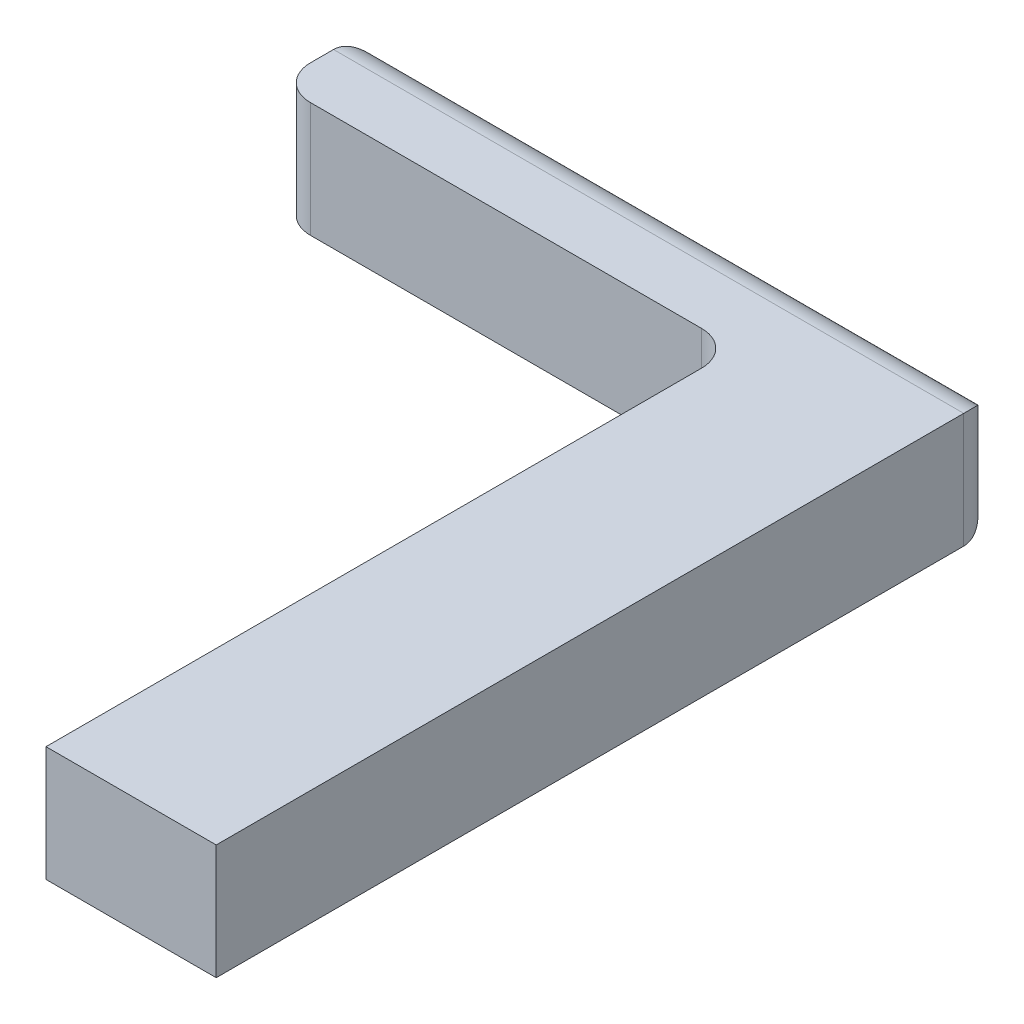
ISO-10303-21;
HEADER;
FILE_DESCRIPTION(('STEP AP214'),'2;1');
FILE_NAME('part.step','',(''),(''),'','','');
FILE_SCHEMA(('AUTOMOTIVE_DESIGN { 1 0 10303 214 1 1 1 1 }'));
ENDSEC;
DATA;
#1=APPLICATION_CONTEXT('core data for automotive mechanical design processes');
#2=APPLICATION_PROTOCOL_DEFINITION('international standard','automotive_design',2000,#1);
#3=PRODUCT_CONTEXT('',#1,'mechanical');
#4=PRODUCT('Part','Part','',(#3));
#5=PRODUCT_RELATED_PRODUCT_CATEGORY('part','',(#4));
#6=PRODUCT_DEFINITION_FORMATION('','',#4);
#7=PRODUCT_DEFINITION_CONTEXT('part definition',#1,'design');
#8=PRODUCT_DEFINITION('design','',#6,#7);
#9=PRODUCT_DEFINITION_SHAPE('','',#8);
#10=(LENGTH_UNIT() NAMED_UNIT(*) SI_UNIT(.MILLI.,.METRE.));
#11=(NAMED_UNIT(*) PLANE_ANGLE_UNIT() SI_UNIT($,.RADIAN.));
#12=(NAMED_UNIT(*) SI_UNIT($,.STERADIAN.) SOLID_ANGLE_UNIT());
#13=UNCERTAINTY_MEASURE_WITH_UNIT(LENGTH_MEASURE(1.E-05),#10,'distance_accuracy_value','');
#14=(GEOMETRIC_REPRESENTATION_CONTEXT(3) GLOBAL_UNCERTAINTY_ASSIGNED_CONTEXT((#13)) GLOBAL_UNIT_ASSIGNED_CONTEXT((#10,
#11,#12)) REPRESENTATION_CONTEXT('',''));
#15=CARTESIAN_POINT('',(0.,0.,0.));
#16=DIRECTION('',(0.,0.,1.));
#17=DIRECTION('',(1.,0.,0.));
#18=AXIS2_PLACEMENT_3D('',#15,#16,#17);
#19=CARTESIAN_POINT('',(-7.4,10.,-34.));
#20=DIRECTION('',(1.,0.,0.));
#21=DIRECTION('',(0.,0.,-1.));
#22=AXIS2_PLACEMENT_3D('',#19,#20,#21);
#23=PLANE('',#22);
#24=DIRECTION('',(0.,0.,1.));
#25=VECTOR('',#24,1.);
#26=CARTESIAN_POINT('',(-7.4,10.,-34.));
#27=LINE('',#26,#25);
#28=CARTESIAN_POINT('',(-7.4,10.,-23.));
#29=VERTEX_POINT('',#28);
#30=CARTESIAN_POINT('',(-7.4,10.,34.));
#31=VERTEX_POINT('',#30);
#32=EDGE_CURVE('E116',#29,#31,#27,.T.);
#33=ORIENTED_EDGE('',*,*,#32,.F.);
#34=DIRECTION('',(0.,1.,0.));
#35=VECTOR('',#34,1.);
#36=CARTESIAN_POINT('',(-7.4,0.,-23.));
#37=LINE('',#36,#35);
#38=CARTESIAN_POINT('',(-7.4,0.,-23.));
#39=VERTEX_POINT('',#38);
#40=EDGE_CURVE('E172',#29,#39,#37,.F.);
#41=ORIENTED_EDGE('',*,*,#40,.T.);
#42=DIRECTION('',(0.,0.,1.));
#43=VECTOR('',#42,1.);
#44=CARTESIAN_POINT('',(-7.4,0.,-34.));
#45=LINE('',#44,#43);
#46=CARTESIAN_POINT('',(-7.4,0.,34.));
#47=VERTEX_POINT('',#46);
#48=EDGE_CURVE('E138',#39,#47,#45,.T.);
#49=ORIENTED_EDGE('',*,*,#48,.T.);
#50=DIRECTION('',(0.,-1.,0.));
#51=VECTOR('',#50,1.);
#52=CARTESIAN_POINT('',(-7.4,10.,34.));
#53=LINE('',#52,#51);
#54=EDGE_CURVE('E131',#31,#47,#53,.T.);
#55=ORIENTED_EDGE('',*,*,#54,.F.);
#56=EDGE_LOOP('',(#33,#41,#49,#55));
#57=FACE_BOUND('',#56,.T.);
#58=ADVANCED_FACE('F37',(#57),#23,.F.);
#59=CARTESIAN_POINT('',(7.40000000000001,10.,34.));
#60=DIRECTION('',(0.,0.,-1.));
#61=DIRECTION('',(-1.,0.,0.));
#62=AXIS2_PLACEMENT_3D('',#59,#60,#61);
#63=PLANE('',#62);
#64=DIRECTION('',(1.,0.,0.));
#65=VECTOR('',#64,1.);
#66=CARTESIAN_POINT('',(7.40000000000001,0.,34.));
#67=LINE('',#66,#65);
#68=CARTESIAN_POINT('',(7.40000000000001,0.,34.));
#69=VERTEX_POINT('',#68);
#70=EDGE_CURVE('E204',#47,#69,#67,.T.);
#71=ORIENTED_EDGE('',*,*,#70,.T.);
#72=DIRECTION('',(0.,-1.,0.));
#73=VECTOR('',#72,1.);
#74=CARTESIAN_POINT('',(7.40000000000001,10.,34.));
#75=LINE('',#74,#73);
#76=CARTESIAN_POINT('',(7.40000000000001,10.,34.));
#77=VERTEX_POINT('',#76);
#78=EDGE_CURVE('E133',#77,#69,#75,.T.);
#79=ORIENTED_EDGE('',*,*,#78,.F.);
#80=DIRECTION('',(1.,0.,0.));
#81=VECTOR('',#80,1.);
#82=CARTESIAN_POINT('',(7.40000000000001,10.,34.));
#83=LINE('',#82,#81);
#84=EDGE_CURVE('E120',#31,#77,#83,.T.);
#85=ORIENTED_EDGE('',*,*,#84,.F.);
#86=ORIENTED_EDGE('',*,*,#54,.T.);
#87=EDGE_LOOP('',(#71,#79,#85,#86));
#88=FACE_BOUND('',#87,.T.);
#89=ADVANCED_FACE('F130',(#88),#63,.F.);
#90=CARTESIAN_POINT('',(7.4,10.,-34.));
#91=DIRECTION('',(-1.,0.,0.));
#92=DIRECTION('',(0.,0.,1.));
#93=AXIS2_PLACEMENT_3D('',#90,#91,#92);
#94=PLANE('',#93);
#95=DIRECTION('',(0.,0.,-1.));
#96=VECTOR('',#95,1.);
#97=CARTESIAN_POINT('',(7.4,0.,-34.));
#98=LINE('',#97,#96);
#99=CARTESIAN_POINT('',(7.4,0.,-31.));
#100=VERTEX_POINT('',#99);
#101=EDGE_CURVE('E126',#69,#100,#98,.T.);
#102=ORIENTED_EDGE('',*,*,#101,.T.);
#103=DIRECTION('',(0.,-1.,0.));
#104=VECTOR('',#103,1.);
#105=CARTESIAN_POINT('',(7.4,10.,-31.));
#106=LINE('',#105,#104);
#107=CARTESIAN_POINT('',(7.4,10.,-31.));
#108=VERTEX_POINT('',#107);
#109=EDGE_CURVE('E170',#100,#108,#106,.F.);
#110=ORIENTED_EDGE('',*,*,#109,.T.);
#111=DIRECTION('',(0.,0.,-1.));
#112=VECTOR('',#111,1.);
#113=CARTESIAN_POINT('',(7.4,10.,-34.));
#114=LINE('',#113,#112);
#115=EDGE_CURVE('E135',#77,#108,#114,.T.);
#116=ORIENTED_EDGE('',*,*,#115,.F.);
#117=ORIENTED_EDGE('',*,*,#78,.T.);
#118=EDGE_LOOP('',(#102,#110,#116,#117));
#119=FACE_BOUND('',#118,.T.);
#120=ADVANCED_FACE('F206',(#119),#94,.F.);
#121=CARTESIAN_POINT('',(7.4,10.,-34.));
#122=DIRECTION('',(0.,0.,1.));
#123=DIRECTION('',(1.,0.,0.));
#124=AXIS2_PLACEMENT_3D('',#121,#122,#123);
#125=PLANE('',#124);
#126=DIRECTION('',(-1.,0.,0.));
#127=VECTOR('',#126,1.);
#128=CARTESIAN_POINT('',(-47.4,3.,-34.));
#129=LINE('',#128,#127);
#130=CARTESIAN_POINT('',(4.4,3.,-34.));
#131=VERTEX_POINT('',#130);
#132=CARTESIAN_POINT('',(-44.4,3.,-34.));
#133=VERTEX_POINT('',#132);
#134=EDGE_CURVE('E151',#131,#133,#129,.T.);
#135=ORIENTED_EDGE('',*,*,#134,.T.);
#136=DIRECTION('',(0.,-1.,0.));
#137=VECTOR('',#136,1.);
#138=CARTESIAN_POINT('',(-44.4,10.,-34.));
#139=LINE('',#138,#137);
#140=CARTESIAN_POINT('',(-44.4,7.,-34.));
#141=VERTEX_POINT('',#140);
#142=EDGE_CURVE('E156',#133,#141,#139,.F.);
#143=ORIENTED_EDGE('',*,*,#142,.T.);
#144=DIRECTION('',(-1.,0.,0.));
#145=VECTOR('',#144,1.);
#146=CARTESIAN_POINT('',(7.4,7.,-34.));
#147=LINE('',#146,#145);
#148=CARTESIAN_POINT('',(4.4,7.,-34.));
#149=VERTEX_POINT('',#148);
#150=EDGE_CURVE('E153',#141,#149,#147,.F.);
#151=ORIENTED_EDGE('',*,*,#150,.T.);
#152=DIRECTION('',(0.,-1.,0.));
#153=VECTOR('',#152,1.);
#154=CARTESIAN_POINT('',(4.4,10.,-34.));
#155=LINE('',#154,#153);
#156=EDGE_CURVE('E149',#149,#131,#155,.T.);
#157=ORIENTED_EDGE('',*,*,#156,.T.);
#158=EDGE_LOOP('',(#135,#143,#151,#157));
#159=FACE_BOUND('',#158,.T.);
#160=ADVANCED_FACE('F236',(#159),#125,.F.);
#161=CARTESIAN_POINT('',(0.,10.,0.));
#162=DIRECTION('',(0.,-1.,0.));
#163=DIRECTION('',(0.,0.,-1.));
#164=AXIS2_PLACEMENT_3D('',#161,#162,#163);
#165=PLANE('',#164);
#166=ORIENTED_EDGE('',*,*,#115,.T.);
#167=DIRECTION('',(-1.,0.,0.));
#168=VECTOR('',#167,1.);
#169=CARTESIAN_POINT('',(0.,10.,-31.));
#170=LINE('',#169,#168);
#171=CARTESIAN_POINT('',(-47.4,10.,-31.));
#172=VERTEX_POINT('',#171);
#173=EDGE_CURVE('E142',#108,#172,#170,.T.);
#174=ORIENTED_EDGE('',*,*,#173,.T.);
#175=DIRECTION('',(0.,0.,-1.));
#176=VECTOR('',#175,1.);
#177=CARTESIAN_POINT('',(-47.4,10.,-34.));
#178=LINE('',#177,#176);
#179=CARTESIAN_POINT('',(-47.4,10.,-29.));
#180=VERTEX_POINT('',#179);
#181=EDGE_CURVE('E190',#180,#172,#178,.T.);
#182=ORIENTED_EDGE('',*,*,#181,.F.);
#183=CARTESIAN_POINT('',(-44.4,10.,-29.));
#184=DIRECTION('',(0.,-1.,0.));
#185=DIRECTION('',(0.,0.,-1.));
#186=AXIS2_PLACEMENT_3D('',#183,#184,#185);
#187=CIRCLE('',#186,3.);
#188=CARTESIAN_POINT('',(-44.4,10.,-26.));
#189=VERTEX_POINT('',#188);
#190=EDGE_CURVE('E140',#180,#189,#187,.F.);
#191=ORIENTED_EDGE('',*,*,#190,.T.);
#192=DIRECTION('',(1.,0.,0.));
#193=VECTOR('',#192,1.);
#194=CARTESIAN_POINT('',(-47.4,10.,-26.));
#195=LINE('',#194,#193);
#196=CARTESIAN_POINT('',(-10.4,10.,-26.));
#197=VERTEX_POINT('',#196);
#198=EDGE_CURVE('E195',#189,#197,#195,.T.);
#199=ORIENTED_EDGE('',*,*,#198,.T.);
#200=CARTESIAN_POINT('',(-10.4,10.,-23.));
#201=DIRECTION('',(0.,-1.,0.));
#202=DIRECTION('',(0.,0.,-1.));
#203=AXIS2_PLACEMENT_3D('',#200,#201,#202);
#204=CIRCLE('',#203,3.);
#205=EDGE_CURVE('E46',#197,#29,#204,.T.);
#206=ORIENTED_EDGE('',*,*,#205,.T.);
#207=ORIENTED_EDGE('',*,*,#32,.T.);
#208=ORIENTED_EDGE('',*,*,#84,.T.);
#209=EDGE_LOOP('',(#166,#174,#182,#191,#199,#206,#207,#208));
#210=FACE_BOUND('',#209,.T.);
#211=ADVANCED_FACE('F119',(#210),#165,.F.);
#212=CARTESIAN_POINT('',(0.,0.,0.));
#213=DIRECTION('',(0.,-1.,0.));
#214=DIRECTION('',(0.,0.,-1.));
#215=AXIS2_PLACEMENT_3D('',#212,#213,#214);
#216=PLANE('',#215);
#217=DIRECTION('',(0.,0.,1.));
#218=VECTOR('',#217,1.);
#219=CARTESIAN_POINT('',(-47.4,0.,-34.));
#220=LINE('',#219,#218);
#221=CARTESIAN_POINT('',(-47.4,0.,-31.));
#222=VERTEX_POINT('',#221);
#223=CARTESIAN_POINT('',(-47.4,0.,-29.));
#224=VERTEX_POINT('',#223);
#225=EDGE_CURVE('E185',#222,#224,#220,.T.);
#226=ORIENTED_EDGE('',*,*,#225,.F.);
#227=DIRECTION('',(-1.,0.,0.));
#228=VECTOR('',#227,1.);
#229=CARTESIAN_POINT('',(7.4,0.,-31.));
#230=LINE('',#229,#228);
#231=EDGE_CURVE('E54',#222,#100,#230,.F.);
#232=ORIENTED_EDGE('',*,*,#231,.T.);
#233=ORIENTED_EDGE('',*,*,#101,.F.);
#234=ORIENTED_EDGE('',*,*,#70,.F.);
#235=ORIENTED_EDGE('',*,*,#48,.F.);
#236=CARTESIAN_POINT('',(-10.4,0.,-23.));
#237=DIRECTION('',(0.,-1.,0.));
#238=DIRECTION('',(0.,0.,-1.));
#239=AXIS2_PLACEMENT_3D('',#236,#237,#238);
#240=CIRCLE('',#239,3.);
#241=CARTESIAN_POINT('',(-10.4,0.,-26.));
#242=VERTEX_POINT('',#241);
#243=EDGE_CURVE('E11',#39,#242,#240,.F.);
#244=ORIENTED_EDGE('',*,*,#243,.T.);
#245=DIRECTION('',(1.,0.,0.));
#246=VECTOR('',#245,1.);
#247=CARTESIAN_POINT('',(-47.4,0.,-26.));
#248=LINE('',#247,#246);
#249=CARTESIAN_POINT('',(-44.4,0.,-26.));
#250=VERTEX_POINT('',#249);
#251=EDGE_CURVE('E199',#250,#242,#248,.T.);
#252=ORIENTED_EDGE('',*,*,#251,.F.);
#253=CARTESIAN_POINT('',(-44.4,0.,-29.));
#254=DIRECTION('',(0.,-1.,0.));
#255=DIRECTION('',(0.,0.,-1.));
#256=AXIS2_PLACEMENT_3D('',#253,#254,#255);
#257=CIRCLE('',#256,3.);
#258=EDGE_CURVE('E60',#250,#224,#257,.T.);
#259=ORIENTED_EDGE('',*,*,#258,.T.);
#260=EDGE_LOOP('',(#226,#232,#233,#234,#235,#244,#252,#259));
#261=FACE_BOUND('',#260,.T.);
#262=ADVANCED_FACE('F228',(#261),#216,.T.);
#263=CARTESIAN_POINT('',(-47.4,10.,-26.));
#264=DIRECTION('',(0.,0.,-1.));
#265=DIRECTION('',(-1.,0.,0.));
#266=AXIS2_PLACEMENT_3D('',#263,#264,#265);
#267=PLANE('',#266);
#268=ORIENTED_EDGE('',*,*,#198,.F.);
#269=DIRECTION('',(0.,1.,0.));
#270=VECTOR('',#269,1.);
#271=CARTESIAN_POINT('',(-44.4,0.,-26.));
#272=LINE('',#271,#270);
#273=EDGE_CURVE('E168',#189,#250,#272,.F.);
#274=ORIENTED_EDGE('',*,*,#273,.T.);
#275=ORIENTED_EDGE('',*,*,#251,.T.);
#276=DIRECTION('',(0.,1.,0.));
#277=VECTOR('',#276,1.);
#278=CARTESIAN_POINT('',(-10.4,10.,-26.));
#279=LINE('',#278,#277);
#280=EDGE_CURVE('E165',#242,#197,#279,.T.);
#281=ORIENTED_EDGE('',*,*,#280,.T.);
#282=EDGE_LOOP('',(#268,#274,#275,#281));
#283=FACE_BOUND('',#282,.T.);
#284=ADVANCED_FACE('F224',(#283),#267,.F.);
#285=CARTESIAN_POINT('',(-47.4,0.,0.));
#286=DIRECTION('',(-1.,0.,0.));
#287=DIRECTION('',(0.,0.,1.));
#288=AXIS2_PLACEMENT_3D('',#285,#286,#287);
#289=PLANE('',#288);
#290=ORIENTED_EDGE('',*,*,#181,.T.);
#291=DIRECTION('',(0.,-1.,0.));
#292=VECTOR('',#291,1.);
#293=CARTESIAN_POINT('',(-47.4,0.,-31.));
#294=LINE('',#293,#292);
#295=EDGE_CURVE('E163',#172,#222,#294,.T.);
#296=ORIENTED_EDGE('',*,*,#295,.T.);
#297=ORIENTED_EDGE('',*,*,#225,.T.);
#298=DIRECTION('',(0.,1.,0.));
#299=VECTOR('',#298,1.);
#300=CARTESIAN_POINT('',(-47.4,10.,-29.));
#301=LINE('',#300,#299);
#302=EDGE_CURVE('E160',#224,#180,#301,.T.);
#303=ORIENTED_EDGE('',*,*,#302,.T.);
#304=EDGE_LOOP('',(#290,#296,#297,#303));
#305=FACE_BOUND('',#304,.T.);
#306=ADVANCED_FACE('F218',(#305),#289,.T.);
#307=CARTESIAN_POINT('',(7.4,3.,-31.));
#308=DIRECTION('',(1.,0.,0.));
#309=DIRECTION('',(0.,0.,-1.));
#310=AXIS2_PLACEMENT_3D('',#307,#308,#309);
#311=CYLINDRICAL_SURFACE('',#310,3.);
#312=CARTESIAN_POINT('',(-44.4,3.,-31.));
#313=DIRECTION('',(-0.707106781186547,0.707106781186547,0.));
#314=DIRECTION('',(0.707106781186547,0.707106781186547,0.));
#315=AXIS2_PLACEMENT_3D('',#312,#313,#314);
#316=ELLIPSE('',#315,4.24264068711928,3.);
#317=EDGE_CURVE('E178',#133,#222,#316,.T.);
#318=ORIENTED_EDGE('',*,*,#317,.F.);
#319=ORIENTED_EDGE('',*,*,#134,.F.);
#320=CARTESIAN_POINT('',(4.4,3.,-31.));
#321=DIRECTION('',(-0.707106781186547,-0.707106781186547,0.));
#322=DIRECTION('',(0.707106781186547,-0.707106781186547,0.));
#323=AXIS2_PLACEMENT_3D('',#320,#321,#322);
#324=ELLIPSE('',#323,4.24264068711928,3.);
#325=EDGE_CURVE('E41',#100,#131,#324,.F.);
#326=ORIENTED_EDGE('',*,*,#325,.F.);
#327=ORIENTED_EDGE('',*,*,#231,.F.);
#328=EDGE_LOOP('',(#318,#319,#326,#327));
#329=FACE_BOUND('',#328,.T.);
#330=ADVANCED_FACE('F209',(#329),#311,.T.);
#331=CARTESIAN_POINT('',(4.4,10.,-31.));
#332=DIRECTION('',(0.,-1.,0.));
#333=DIRECTION('',(0.,0.,-1.));
#334=AXIS2_PLACEMENT_3D('',#331,#332,#333);
#335=CYLINDRICAL_SURFACE('',#334,3.);
#336=ORIENTED_EDGE('',*,*,#325,.T.);
#337=ORIENTED_EDGE('',*,*,#156,.F.);
#338=CARTESIAN_POINT('',(4.4,7.,-31.));
#339=DIRECTION('',(0.707106781186547,-0.707106781186547,0.));
#340=DIRECTION('',(-0.707106781186547,-0.707106781186547,0.));
#341=AXIS2_PLACEMENT_3D('',#338,#339,#340);
#342=ELLIPSE('',#341,4.24264068711928,3.);
#343=EDGE_CURVE('E177',#108,#149,#342,.F.);
#344=ORIENTED_EDGE('',*,*,#343,.F.);
#345=ORIENTED_EDGE('',*,*,#109,.F.);
#346=EDGE_LOOP('',(#336,#337,#344,#345));
#347=FACE_BOUND('',#346,.T.);
#348=ADVANCED_FACE('F211',(#347),#335,.T.);
#349=CARTESIAN_POINT('',(-44.4,0.,-31.));
#350=DIRECTION('',(0.,1.,0.));
#351=DIRECTION('',(0.,0.,1.));
#352=AXIS2_PLACEMENT_3D('',#349,#350,#351);
#353=CYLINDRICAL_SURFACE('',#352,3.);
#354=ORIENTED_EDGE('',*,*,#317,.T.);
#355=ORIENTED_EDGE('',*,*,#295,.F.);
#356=CARTESIAN_POINT('',(-44.4,7.,-31.));
#357=DIRECTION('',(0.707106781186547,0.707106781186547,0.));
#358=DIRECTION('',(-0.707106781186547,0.707106781186547,0.));
#359=AXIS2_PLACEMENT_3D('',#356,#357,#358);
#360=ELLIPSE('',#359,4.24264068711928,3.);
#361=EDGE_CURVE('E175',#141,#172,#360,.T.);
#362=ORIENTED_EDGE('',*,*,#361,.F.);
#363=ORIENTED_EDGE('',*,*,#142,.F.);
#364=EDGE_LOOP('',(#354,#355,#362,#363));
#365=FACE_BOUND('',#364,.T.);
#366=ADVANCED_FACE('F249',(#365),#353,.T.);
#367=CARTESIAN_POINT('',(0.,7.,-31.));
#368=DIRECTION('',(-1.,0.,0.));
#369=DIRECTION('',(0.,0.,1.));
#370=AXIS2_PLACEMENT_3D('',#367,#368,#369);
#371=CYLINDRICAL_SURFACE('',#370,3.);
#372=ORIENTED_EDGE('',*,*,#343,.T.);
#373=ORIENTED_EDGE('',*,*,#150,.F.);
#374=ORIENTED_EDGE('',*,*,#361,.T.);
#375=ORIENTED_EDGE('',*,*,#173,.F.);
#376=EDGE_LOOP('',(#372,#373,#374,#375));
#377=FACE_BOUND('',#376,.T.);
#378=ADVANCED_FACE('F215',(#377),#371,.T.);
#379=CARTESIAN_POINT('',(-44.4,0.,-29.));
#380=DIRECTION('',(0.,-1.,0.));
#381=DIRECTION('',(0.,0.,-1.));
#382=AXIS2_PLACEMENT_3D('',#379,#380,#381);
#383=CYLINDRICAL_SURFACE('',#382,3.);
#384=ORIENTED_EDGE('',*,*,#258,.F.);
#385=ORIENTED_EDGE('',*,*,#273,.F.);
#386=ORIENTED_EDGE('',*,*,#190,.F.);
#387=ORIENTED_EDGE('',*,*,#302,.F.);
#388=EDGE_LOOP('',(#384,#385,#386,#387));
#389=FACE_BOUND('',#388,.T.);
#390=ADVANCED_FACE('F220',(#389),#383,.T.);
#391=CARTESIAN_POINT('',(-10.4,10.,-23.));
#392=DIRECTION('',(0.,-1.,0.));
#393=DIRECTION('',(0.,0.,-1.));
#394=AXIS2_PLACEMENT_3D('',#391,#392,#393);
#395=CYLINDRICAL_SURFACE('',#394,3.);
#396=ORIENTED_EDGE('',*,*,#243,.F.);
#397=ORIENTED_EDGE('',*,*,#40,.F.);
#398=ORIENTED_EDGE('',*,*,#205,.F.);
#399=ORIENTED_EDGE('',*,*,#280,.F.);
#400=EDGE_LOOP('',(#396,#397,#398,#399));
#401=FACE_BOUND('',#400,.T.);
#402=ADVANCED_FACE('F39',(#401),#395,.F.);
#403=CLOSED_SHELL('',(#58,#89,#120,#160,#211,#262,#284,#306,#330,#348,#366,#378,#390,#402));
#404=MANIFOLD_SOLID_BREP('B2',#403);
#405=ADVANCED_BREP_SHAPE_REPRESENTATION('',(#18,#404),#14);
#406=SHAPE_DEFINITION_REPRESENTATION(#9,#405);
ENDSEC;
END-ISO-10303-21;
